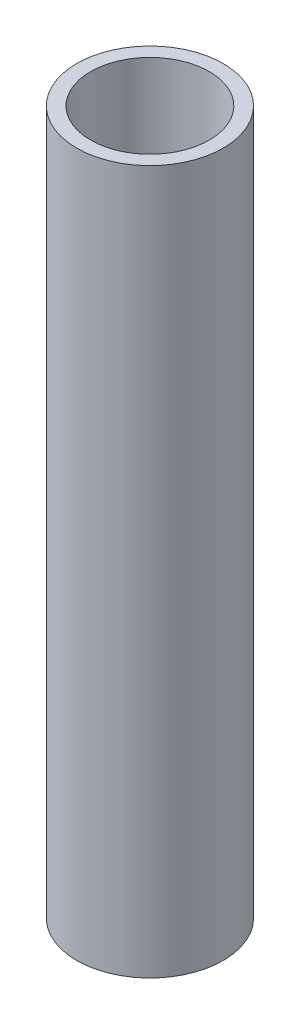
ISO-10303-21;
HEADER;
FILE_DESCRIPTION(('STEP AP214'),'2;1');
FILE_NAME('part.step','',(''),(''),'','','');
FILE_SCHEMA(('AUTOMOTIVE_DESIGN { 1 0 10303 214 1 1 1 1 }'));
ENDSEC;
DATA;
#1=APPLICATION_CONTEXT('core data for automotive mechanical design processes');
#2=APPLICATION_PROTOCOL_DEFINITION('international standard','automotive_design',2000,#1);
#3=PRODUCT_CONTEXT('',#1,'mechanical');
#4=PRODUCT('Part','Part','',(#3));
#5=PRODUCT_RELATED_PRODUCT_CATEGORY('part','',(#4));
#6=PRODUCT_DEFINITION_FORMATION('','',#4);
#7=PRODUCT_DEFINITION_CONTEXT('part definition',#1,'design');
#8=PRODUCT_DEFINITION('design','',#6,#7);
#9=PRODUCT_DEFINITION_SHAPE('','',#8);
#10=(LENGTH_UNIT() NAMED_UNIT(*) SI_UNIT(.MILLI.,.METRE.));
#11=(NAMED_UNIT(*) PLANE_ANGLE_UNIT() SI_UNIT($,.RADIAN.));
#12=(NAMED_UNIT(*) SI_UNIT($,.STERADIAN.) SOLID_ANGLE_UNIT());
#13=UNCERTAINTY_MEASURE_WITH_UNIT(LENGTH_MEASURE(1.E-05),#10,'distance_accuracy_value','');
#14=(GEOMETRIC_REPRESENTATION_CONTEXT(3) GLOBAL_UNCERTAINTY_ASSIGNED_CONTEXT((#13)) GLOBAL_UNIT_ASSIGNED_CONTEXT((#10,
#11,#12)) REPRESENTATION_CONTEXT('',''));
#15=CARTESIAN_POINT('',(0.,0.,0.));
#16=DIRECTION('',(0.,0.,1.));
#17=DIRECTION('',(1.,0.,0.));
#18=AXIS2_PLACEMENT_3D('',#15,#16,#17);
#19=CARTESIAN_POINT('',(0.,4.8,0.));
#20=DIRECTION('',(0.,-1.,0.));
#21=DIRECTION('',(0.,0.,-1.));
#22=AXIS2_PLACEMENT_3D('',#19,#20,#21);
#23=CYLINDRICAL_SURFACE('',#22,0.5);
#24=CARTESIAN_POINT('',(0.,4.8,0.));
#25=DIRECTION('',(0.,1.,0.));
#26=DIRECTION('',(0.,0.,1.));
#27=AXIS2_PLACEMENT_3D('',#24,#25,#26);
#28=CIRCLE('',#27,0.5);
#29=CARTESIAN_POINT('',(0.,4.8,0.5));
#30=VERTEX_POINT('',#29);
#31=EDGE_CURVE('E10',#30,#30,#28,.T.);
#32=ORIENTED_EDGE('',*,*,#31,.F.);
#33=EDGE_LOOP('',(#32));
#34=FACE_BOUND('',#33,.T.);
#35=CARTESIAN_POINT('',(0.,0.,0.));
#36=DIRECTION('',(0.,1.,0.));
#37=DIRECTION('',(0.,0.,1.));
#38=AXIS2_PLACEMENT_3D('',#35,#36,#37);
#39=CIRCLE('',#38,0.5);
#40=CARTESIAN_POINT('',(0.,0.,0.5));
#41=VERTEX_POINT('',#40);
#42=EDGE_CURVE('E44',#41,#41,#39,.T.);
#43=ORIENTED_EDGE('',*,*,#42,.T.);
#44=EDGE_LOOP('',(#43));
#45=FACE_BOUND('',#44,.T.);
#46=ADVANCED_FACE('F36',(#34,#45),#23,.T.);
#47=CARTESIAN_POINT('',(0.,4.8,0.));
#48=DIRECTION('',(0.,1.,0.));
#49=DIRECTION('',(0.,0.,1.));
#50=AXIS2_PLACEMENT_3D('',#47,#48,#49);
#51=PLANE('',#50);
#52=CARTESIAN_POINT('',(0.,4.8,0.));
#53=DIRECTION('',(0.,1.,0.));
#54=DIRECTION('',(0.,0.,1.));
#55=AXIS2_PLACEMENT_3D('',#52,#53,#54);
#56=CIRCLE('',#55,0.405);
#57=CARTESIAN_POINT('',(0.,4.8,0.405));
#58=VERTEX_POINT('',#57);
#59=EDGE_CURVE('E51',#58,#58,#56,.T.);
#60=ORIENTED_EDGE('',*,*,#59,.F.);
#61=EDGE_LOOP('',(#60));
#62=FACE_BOUND('',#61,.T.);
#63=ORIENTED_EDGE('',*,*,#31,.T.);
#64=EDGE_LOOP('',(#63));
#65=FACE_BOUND('',#64,.T.);
#66=ADVANCED_FACE('F65',(#62,#65),#51,.T.);
#67=CARTESIAN_POINT('',(0.,0.,0.));
#68=DIRECTION('',(0.,1.,0.));
#69=DIRECTION('',(0.,0.,1.));
#70=AXIS2_PLACEMENT_3D('',#67,#68,#69);
#71=PLANE('',#70);
#72=CARTESIAN_POINT('',(0.,0.,0.));
#73=DIRECTION('',(0.,1.,0.));
#74=DIRECTION('',(0.,0.,1.));
#75=AXIS2_PLACEMENT_3D('',#72,#73,#74);
#76=CIRCLE('',#75,0.405);
#77=CARTESIAN_POINT('',(0.,0.,0.405));
#78=VERTEX_POINT('',#77);
#79=EDGE_CURVE('E39',#78,#78,#76,.F.);
#80=ORIENTED_EDGE('',*,*,#79,.F.);
#81=EDGE_LOOP('',(#80));
#82=FACE_BOUND('',#81,.T.);
#83=ORIENTED_EDGE('',*,*,#42,.F.);
#84=EDGE_LOOP('',(#83));
#85=FACE_BOUND('',#84,.T.);
#86=ADVANCED_FACE('F62',(#82,#85),#71,.F.);
#87=CARTESIAN_POINT('',(0.,4.8,0.));
#88=DIRECTION('',(0.,-1.,0.));
#89=DIRECTION('',(0.,0.,-1.));
#90=AXIS2_PLACEMENT_3D('',#87,#88,#89);
#91=CYLINDRICAL_SURFACE('',#90,0.405);
#92=ORIENTED_EDGE('',*,*,#59,.T.);
#93=EDGE_LOOP('',(#92));
#94=FACE_BOUND('',#93,.T.);
#95=ORIENTED_EDGE('',*,*,#79,.T.);
#96=EDGE_LOOP('',(#95));
#97=FACE_BOUND('',#96,.T.);
#98=ADVANCED_FACE('F60',(#94,#97),#91,.F.);
#99=CLOSED_SHELL('',(#46,#66,#86,#98));
#100=MANIFOLD_SOLID_BREP('B2',#99);
#101=ADVANCED_BREP_SHAPE_REPRESENTATION('',(#18,#100),#14);
#102=SHAPE_DEFINITION_REPRESENTATION(#9,#101);
ENDSEC;
END-ISO-10303-21;
